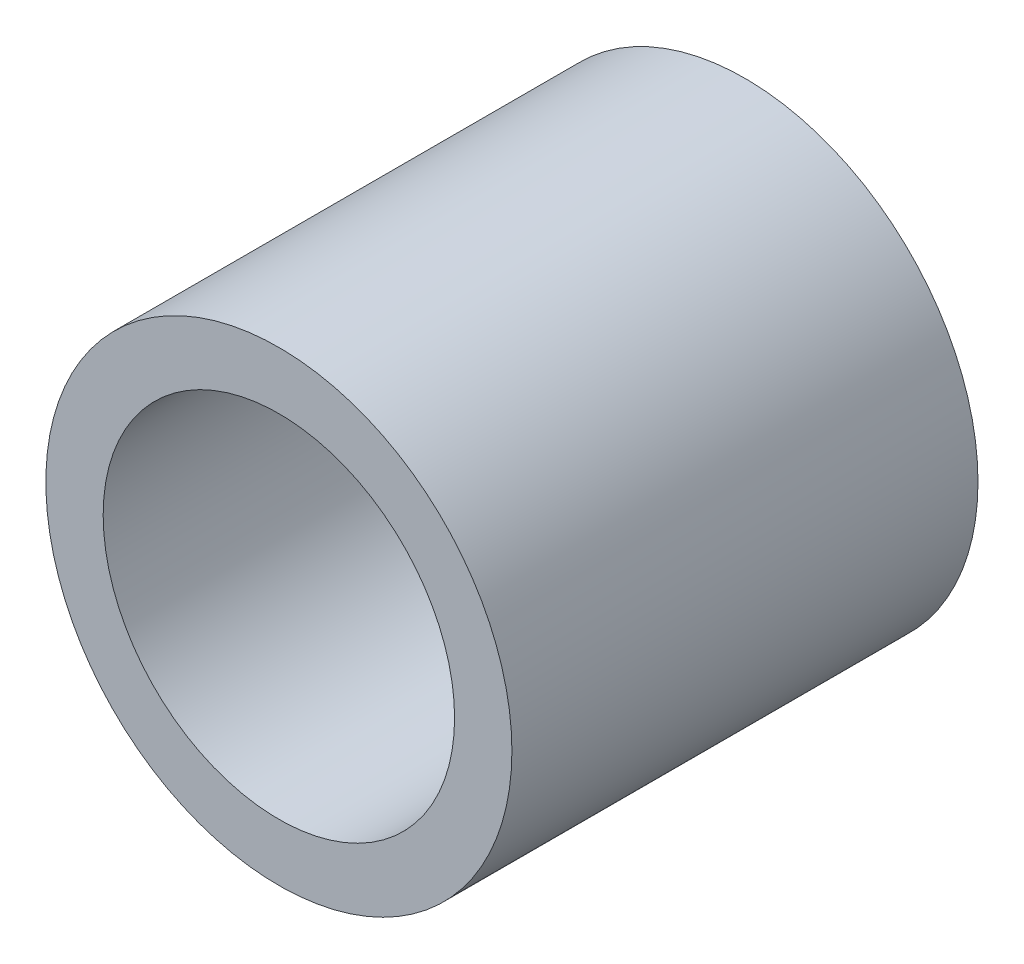
ISO-10303-21;
HEADER;
FILE_DESCRIPTION(('STEP AP214'),'2;1');
FILE_NAME('part.step','',(''),(''),'','','');
FILE_SCHEMA(('AUTOMOTIVE_DESIGN { 1 0 10303 214 1 1 1 1 }'));
ENDSEC;
DATA;
#1=APPLICATION_CONTEXT('core data for automotive mechanical design processes');
#2=APPLICATION_PROTOCOL_DEFINITION('international standard','automotive_design',2000,#1);
#3=PRODUCT_CONTEXT('',#1,'mechanical');
#4=PRODUCT('Part','Part','',(#3));
#5=PRODUCT_RELATED_PRODUCT_CATEGORY('part','',(#4));
#6=PRODUCT_DEFINITION_FORMATION('','',#4);
#7=PRODUCT_DEFINITION_CONTEXT('part definition',#1,'design');
#8=PRODUCT_DEFINITION('design','',#6,#7);
#9=PRODUCT_DEFINITION_SHAPE('','',#8);
#10=(LENGTH_UNIT() NAMED_UNIT(*) SI_UNIT(.MILLI.,.METRE.));
#11=(NAMED_UNIT(*) PLANE_ANGLE_UNIT() SI_UNIT($,.RADIAN.));
#12=(NAMED_UNIT(*) SI_UNIT($,.STERADIAN.) SOLID_ANGLE_UNIT());
#13=UNCERTAINTY_MEASURE_WITH_UNIT(LENGTH_MEASURE(1.E-05),#10,'distance_accuracy_value','');
#14=(GEOMETRIC_REPRESENTATION_CONTEXT(3) GLOBAL_UNCERTAINTY_ASSIGNED_CONTEXT((#13)) GLOBAL_UNIT_ASSIGNED_CONTEXT((#10,
#11,#12)) REPRESENTATION_CONTEXT('',''));
#15=CARTESIAN_POINT('',(0.,0.,0.));
#16=DIRECTION('',(0.,0.,1.));
#17=DIRECTION('',(1.,0.,0.));
#18=AXIS2_PLACEMENT_3D('',#15,#16,#17);
#19=CARTESIAN_POINT('',(0.,0.,6.35));
#20=DIRECTION('',(0.,0.,1.));
#21=DIRECTION('',(1.,0.,0.));
#22=AXIS2_PLACEMENT_3D('',#19,#20,#21);
#23=PLANE('',#22);
#24=CARTESIAN_POINT('',(0.,0.,6.35));
#25=DIRECTION('',(0.,0.,1.));
#26=DIRECTION('',(1.,0.,0.));
#27=AXIS2_PLACEMENT_3D('',#24,#25,#26);
#28=CIRCLE('',#27,6.35);
#29=CARTESIAN_POINT('',(6.35,0.,6.35));
#30=VERTEX_POINT('',#29);
#31=EDGE_CURVE('E10',#30,#30,#28,.T.);
#32=ORIENTED_EDGE('',*,*,#31,.T.);
#33=EDGE_LOOP('',(#32));
#34=FACE_BOUND('',#33,.T.);
#35=CARTESIAN_POINT('',(0.,0.,6.35));
#36=DIRECTION('',(0.,0.,1.));
#37=DIRECTION('',(1.,0.,0.));
#38=AXIS2_PLACEMENT_3D('',#35,#36,#37);
#39=CIRCLE('',#38,4.7879);
#40=CARTESIAN_POINT('',(4.7879,0.,6.35));
#41=VERTEX_POINT('',#40);
#42=EDGE_CURVE('E41',#41,#41,#39,.T.);
#43=ORIENTED_EDGE('',*,*,#42,.F.);
#44=EDGE_LOOP('',(#43));
#45=FACE_BOUND('',#44,.T.);
#46=ADVANCED_FACE('F30',(#34,#45),#23,.T.);
#47=CARTESIAN_POINT('',(0.,0.,-6.35));
#48=DIRECTION('',(0.,0.,1.));
#49=DIRECTION('',(1.,0.,0.));
#50=AXIS2_PLACEMENT_3D('',#47,#48,#49);
#51=PLANE('',#50);
#52=CARTESIAN_POINT('',(0.,0.,-6.35));
#53=DIRECTION('',(0.,0.,1.));
#54=DIRECTION('',(1.,0.,0.));
#55=AXIS2_PLACEMENT_3D('',#52,#53,#54);
#56=CIRCLE('',#55,6.35);
#57=CARTESIAN_POINT('',(6.35,0.,-6.35));
#58=VERTEX_POINT('',#57);
#59=EDGE_CURVE('E34',#58,#58,#56,.T.);
#60=ORIENTED_EDGE('',*,*,#59,.F.);
#61=EDGE_LOOP('',(#60));
#62=FACE_BOUND('',#61,.T.);
#63=CARTESIAN_POINT('',(0.,0.,-6.35));
#64=DIRECTION('',(0.,0.,1.));
#65=DIRECTION('',(1.,0.,0.));
#66=AXIS2_PLACEMENT_3D('',#63,#64,#65);
#67=CIRCLE('',#66,4.7879);
#68=CARTESIAN_POINT('',(4.7879,0.,-6.35));
#69=VERTEX_POINT('',#68);
#70=EDGE_CURVE('E43',#69,#69,#67,.T.);
#71=ORIENTED_EDGE('',*,*,#70,.T.);
#72=EDGE_LOOP('',(#71));
#73=FACE_BOUND('',#72,.T.);
#74=ADVANCED_FACE('F53',(#62,#73),#51,.F.);
#75=CARTESIAN_POINT('',(0.,0.,6.35));
#76=DIRECTION('',(0.,0.,-1.));
#77=DIRECTION('',(-1.,0.,0.));
#78=AXIS2_PLACEMENT_3D('',#75,#76,#77);
#79=CYLINDRICAL_SURFACE('',#78,6.35);
#80=ORIENTED_EDGE('',*,*,#31,.F.);
#81=EDGE_LOOP('',(#80));
#82=FACE_BOUND('',#81,.T.);
#83=ORIENTED_EDGE('',*,*,#59,.T.);
#84=EDGE_LOOP('',(#83));
#85=FACE_BOUND('',#84,.T.);
#86=ADVANCED_FACE('F32',(#82,#85),#79,.T.);
#87=CARTESIAN_POINT('',(0.,0.,6.35));
#88=DIRECTION('',(0.,0.,-1.));
#89=DIRECTION('',(-1.,0.,0.));
#90=AXIS2_PLACEMENT_3D('',#87,#88,#89);
#91=CYLINDRICAL_SURFACE('',#90,4.7879);
#92=ORIENTED_EDGE('',*,*,#42,.T.);
#93=EDGE_LOOP('',(#92));
#94=FACE_BOUND('',#93,.T.);
#95=ORIENTED_EDGE('',*,*,#70,.F.);
#96=EDGE_LOOP('',(#95));
#97=FACE_BOUND('',#96,.T.);
#98=ADVANCED_FACE('F49',(#94,#97),#91,.F.);
#99=CLOSED_SHELL('',(#46,#74,#86,#98));
#100=MANIFOLD_SOLID_BREP('B2',#99);
#101=ADVANCED_BREP_SHAPE_REPRESENTATION('',(#18,#100),#14);
#102=SHAPE_DEFINITION_REPRESENTATION(#9,#101);
ENDSEC;
END-ISO-10303-21;
